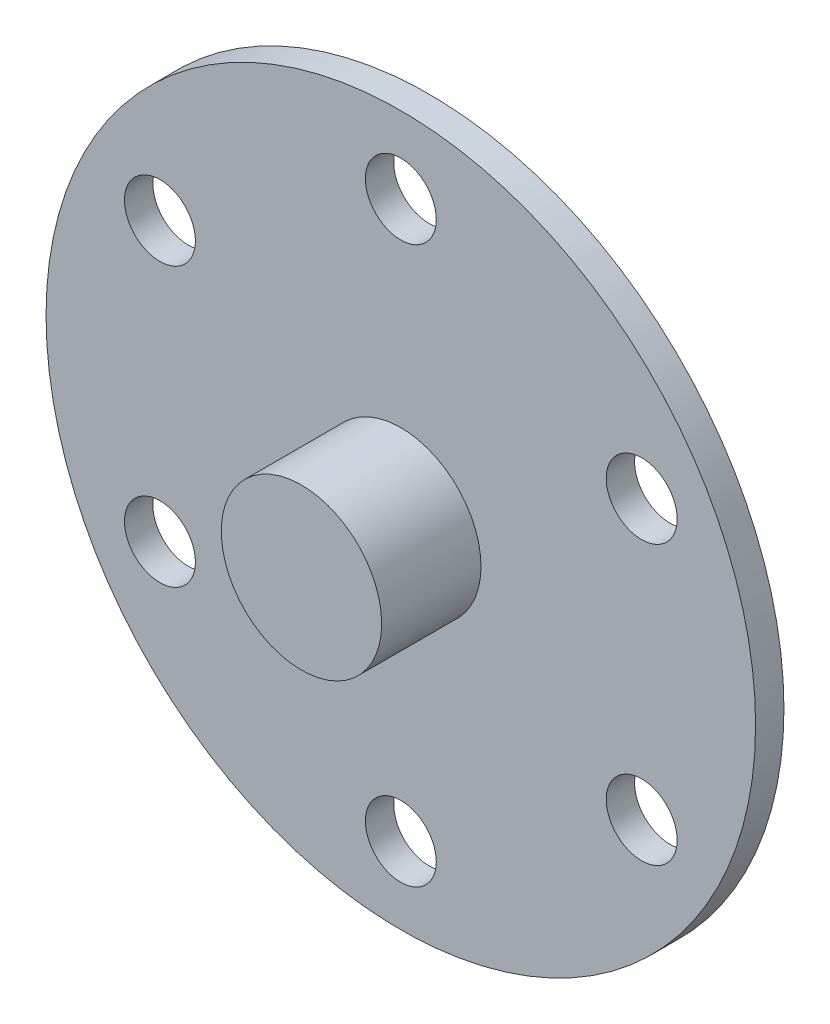
ISO-10303-21;
HEADER;
FILE_DESCRIPTION(('STEP AP214'),'2;1');
FILE_NAME('part.step','',(''),(''),'','','');
FILE_SCHEMA(('AUTOMOTIVE_DESIGN { 1 0 10303 214 1 1 1 1 }'));
ENDSEC;
DATA;
#1=APPLICATION_CONTEXT('core data for automotive mechanical design processes');
#2=APPLICATION_PROTOCOL_DEFINITION('international standard','automotive_design',2000,#1);
#3=PRODUCT_CONTEXT('',#1,'mechanical');
#4=PRODUCT('Part','Part','',(#3));
#5=PRODUCT_RELATED_PRODUCT_CATEGORY('part','',(#4));
#6=PRODUCT_DEFINITION_FORMATION('','',#4);
#7=PRODUCT_DEFINITION_CONTEXT('part definition',#1,'design');
#8=PRODUCT_DEFINITION('design','',#6,#7);
#9=PRODUCT_DEFINITION_SHAPE('','',#8);
#10=(LENGTH_UNIT() NAMED_UNIT(*) SI_UNIT(.MILLI.,.METRE.));
#11=(NAMED_UNIT(*) PLANE_ANGLE_UNIT() SI_UNIT($,.RADIAN.));
#12=(NAMED_UNIT(*) SI_UNIT($,.STERADIAN.) SOLID_ANGLE_UNIT());
#13=UNCERTAINTY_MEASURE_WITH_UNIT(LENGTH_MEASURE(1.E-05),#10,'distance_accuracy_value','');
#14=(GEOMETRIC_REPRESENTATION_CONTEXT(3) GLOBAL_UNCERTAINTY_ASSIGNED_CONTEXT((#13)) GLOBAL_UNIT_ASSIGNED_CONTEXT((#10,
#11,#12)) REPRESENTATION_CONTEXT('',''));
#15=CARTESIAN_POINT('',(0.,0.,0.));
#16=DIRECTION('',(0.,0.,1.));
#17=DIRECTION('',(1.,0.,0.));
#18=AXIS2_PLACEMENT_3D('',#15,#16,#17);
#19=CARTESIAN_POINT('',(0.,0.,-5.08));
#20=DIRECTION('',(0.,0.,1.));
#21=DIRECTION('',(1.,0.,0.));
#22=AXIS2_PLACEMENT_3D('',#19,#20,#21);
#23=CYLINDRICAL_SURFACE('',#22,63.5);
#24=CARTESIAN_POINT('',(0.,0.,-5.08));
#25=DIRECTION('',(0.,0.,1.));
#26=DIRECTION('',(1.,0.,0.));
#27=AXIS2_PLACEMENT_3D('',#24,#25,#26);
#28=CIRCLE('',#27,63.5);
#29=CARTESIAN_POINT('',(63.5,0.,-5.08));
#30=VERTEX_POINT('',#29);
#31=EDGE_CURVE('E41',#30,#30,#28,.T.);
#32=ORIENTED_EDGE('',*,*,#31,.T.);
#33=EDGE_LOOP('',(#32));
#34=FACE_BOUND('',#33,.T.);
#35=CARTESIAN_POINT('',(0.,0.,0.));
#36=DIRECTION('',(0.,0.,1.));
#37=DIRECTION('',(1.,0.,0.));
#38=AXIS2_PLACEMENT_3D('',#35,#36,#37);
#39=CIRCLE('',#38,63.5);
#40=CARTESIAN_POINT('',(63.5,0.,0.));
#41=VERTEX_POINT('',#40);
#42=EDGE_CURVE('E37',#41,#41,#39,.T.);
#43=ORIENTED_EDGE('',*,*,#42,.F.);
#44=EDGE_LOOP('',(#43));
#45=FACE_BOUND('',#44,.T.);
#46=ADVANCED_FACE('F34',(#34,#45),#23,.T.);
#47=CARTESIAN_POINT('',(0.,0.,-5.08));
#48=DIRECTION('',(0.,0.,1.));
#49=DIRECTION('',(1.,0.,0.));
#50=AXIS2_PLACEMENT_3D('',#47,#48,#49);
#51=PLANE('',#50);
#52=CARTESIAN_POINT('',(0.,49.784,-5.08));
#53=DIRECTION('',(0.,0.,1.));
#54=DIRECTION('',(1.,0.,0.));
#55=AXIS2_PLACEMENT_3D('',#52,#53,#54);
#56=CIRCLE('',#55,6.35);
#57=CARTESIAN_POINT('',(6.35,49.784,-5.08));
#58=VERTEX_POINT('',#57);
#59=EDGE_CURVE('E50',#58,#58,#56,.T.);
#60=ORIENTED_EDGE('',*,*,#59,.T.);
#61=EDGE_LOOP('',(#60));
#62=FACE_BOUND('',#61,.T.);
#63=CARTESIAN_POINT('',(-43.1142087020038,24.8919999999987,-5.08));
#64=DIRECTION('',(0.,0.,1.));
#65=DIRECTION('',(1.,0.,0.));
#66=AXIS2_PLACEMENT_3D('',#63,#64,#65);
#67=CIRCLE('',#66,6.35000000000162);
#68=CARTESIAN_POINT('',(-36.7642087020022,24.8919999999987,-5.08));
#69=VERTEX_POINT('',#68);
#70=EDGE_CURVE('E53',#69,#69,#67,.T.);
#71=ORIENTED_EDGE('',*,*,#70,.T.);
#72=EDGE_LOOP('',(#71));
#73=FACE_BOUND('',#72,.T.);
#74=CARTESIAN_POINT('',(-43.1142087020024,-24.8920000000012,-5.08));
#75=DIRECTION('',(0.,0.,1.));
#76=DIRECTION('',(1.,0.,0.));
#77=AXIS2_PLACEMENT_3D('',#74,#75,#76);
#78=CIRCLE('',#77,6.35000000000283);
#79=CARTESIAN_POINT('',(-36.7642087019996,-24.8920000000012,-5.08));
#80=VERTEX_POINT('',#79);
#81=EDGE_CURVE('E56',#80,#80,#78,.T.);
#82=ORIENTED_EDGE('',*,*,#81,.T.);
#83=EDGE_LOOP('',(#82));
#84=FACE_BOUND('',#83,.T.);
#85=CARTESIAN_POINT('',(2.81328214524155E-12,-49.784,-5.08));
#86=DIRECTION('',(0.,0.,1.));
#87=DIRECTION('',(1.,0.,0.));
#88=AXIS2_PLACEMENT_3D('',#85,#86,#87);
#89=CIRCLE('',#88,6.35000000000302);
#90=CARTESIAN_POINT('',(6.35000000000584,-49.784,-5.08));
#91=VERTEX_POINT('',#90);
#92=EDGE_CURVE('E59',#91,#91,#89,.T.);
#93=ORIENTED_EDGE('',*,*,#92,.T.);
#94=EDGE_LOOP('',(#93));
#95=FACE_BOUND('',#94,.T.);
#96=CARTESIAN_POINT('',(43.1142087020066,-24.8919999999988,-5.08));
#97=DIRECTION('',(0.,0.,1.));
#98=DIRECTION('',(1.,0.,0.));
#99=AXIS2_PLACEMENT_3D('',#96,#97,#98);
#100=CIRCLE('',#99,6.3500000000019);
#101=CARTESIAN_POINT('',(49.4642087020085,-24.8919999999988,-5.08));
#102=VERTEX_POINT('',#101);
#103=EDGE_CURVE('E62',#102,#102,#100,.T.);
#104=ORIENTED_EDGE('',*,*,#103,.T.);
#105=EDGE_LOOP('',(#104));
#106=FACE_BOUND('',#105,.T.);
#107=CARTESIAN_POINT('',(43.1142087020052,24.8920000000012,-5.08));
#108=DIRECTION('',(0.,0.,1.));
#109=DIRECTION('',(1.,0.,0.));
#110=AXIS2_PLACEMENT_3D('',#107,#108,#109);
#111=CIRCLE('',#110,6.35000000000045);
#112=CARTESIAN_POINT('',(49.4642087020056,24.8920000000012,-5.08));
#113=VERTEX_POINT('',#112);
#114=EDGE_CURVE('E65',#113,#113,#111,.T.);
#115=ORIENTED_EDGE('',*,*,#114,.T.);
#116=EDGE_LOOP('',(#115));
#117=FACE_BOUND('',#116,.T.);
#118=ORIENTED_EDGE('',*,*,#31,.F.);
#119=EDGE_LOOP('',(#118));
#120=FACE_BOUND('',#119,.T.);
#121=ADVANCED_FACE('F94',(#62,#73,#84,#95,#106,#117,#120),#51,.F.);
#122=CARTESIAN_POINT('',(0.,0.,0.));
#123=DIRECTION('',(0.,0.,1.));
#124=DIRECTION('',(1.,0.,0.));
#125=AXIS2_PLACEMENT_3D('',#122,#123,#124);
#126=PLANE('',#125);
#127=CARTESIAN_POINT('',(0.,49.784,0.));
#128=DIRECTION('',(0.,0.,1.));
#129=DIRECTION('',(1.,0.,0.));
#130=AXIS2_PLACEMENT_3D('',#127,#128,#129);
#131=CIRCLE('',#130,6.35);
#132=CARTESIAN_POINT('',(6.35,49.784,0.));
#133=VERTEX_POINT('',#132);
#134=EDGE_CURVE('E68',#133,#133,#131,.T.);
#135=ORIENTED_EDGE('',*,*,#134,.F.);
#136=EDGE_LOOP('',(#135));
#137=FACE_BOUND('',#136,.T.);
#138=CARTESIAN_POINT('',(-43.1142087020038,24.8919999999987,0.));
#139=DIRECTION('',(0.,0.,1.));
#140=DIRECTION('',(1.,0.,0.));
#141=AXIS2_PLACEMENT_3D('',#138,#139,#140);
#142=CIRCLE('',#141,6.35000000000162);
#143=CARTESIAN_POINT('',(-36.7642087020022,24.8919999999987,0.));
#144=VERTEX_POINT('',#143);
#145=EDGE_CURVE('E73',#144,#144,#142,.T.);
#146=ORIENTED_EDGE('',*,*,#145,.F.);
#147=EDGE_LOOP('',(#146));
#148=FACE_BOUND('',#147,.T.);
#149=CARTESIAN_POINT('',(-43.1142087020024,-24.8920000000012,0.));
#150=DIRECTION('',(0.,0.,1.));
#151=DIRECTION('',(1.,0.,0.));
#152=AXIS2_PLACEMENT_3D('',#149,#150,#151);
#153=CIRCLE('',#152,6.35000000000283);
#154=CARTESIAN_POINT('',(-36.7642087019996,-24.8920000000012,0.));
#155=VERTEX_POINT('',#154);
#156=EDGE_CURVE('E69',#155,#155,#153,.T.);
#157=ORIENTED_EDGE('',*,*,#156,.F.);
#158=EDGE_LOOP('',(#157));
#159=FACE_BOUND('',#158,.T.);
#160=CARTESIAN_POINT('',(2.81328214524155E-12,-49.784,0.));
#161=DIRECTION('',(0.,0.,1.));
#162=DIRECTION('',(1.,0.,0.));
#163=AXIS2_PLACEMENT_3D('',#160,#161,#162);
#164=CIRCLE('',#163,6.35000000000302);
#165=CARTESIAN_POINT('',(6.35000000000584,-49.784,0.));
#166=VERTEX_POINT('',#165);
#167=EDGE_CURVE('E72',#166,#166,#164,.T.);
#168=ORIENTED_EDGE('',*,*,#167,.F.);
#169=EDGE_LOOP('',(#168));
#170=FACE_BOUND('',#169,.T.);
#171=CARTESIAN_POINT('',(43.1142087020066,-24.8919999999988,0.));
#172=DIRECTION('',(0.,0.,1.));
#173=DIRECTION('',(1.,0.,0.));
#174=AXIS2_PLACEMENT_3D('',#171,#172,#173);
#175=CIRCLE('',#174,6.3500000000019);
#176=CARTESIAN_POINT('',(49.4642087020085,-24.8919999999988,0.));
#177=VERTEX_POINT('',#176);
#178=EDGE_CURVE('E76',#177,#177,#175,.T.);
#179=ORIENTED_EDGE('',*,*,#178,.F.);
#180=EDGE_LOOP('',(#179));
#181=FACE_BOUND('',#180,.T.);
#182=CARTESIAN_POINT('',(43.1142087020052,24.8920000000012,0.));
#183=DIRECTION('',(0.,0.,1.));
#184=DIRECTION('',(1.,0.,0.));
#185=AXIS2_PLACEMENT_3D('',#182,#183,#184);
#186=CIRCLE('',#185,6.35000000000045);
#187=CARTESIAN_POINT('',(49.4642087020056,24.8920000000012,0.));
#188=VERTEX_POINT('',#187);
#189=EDGE_CURVE('E79',#188,#188,#186,.T.);
#190=ORIENTED_EDGE('',*,*,#189,.F.);
#191=EDGE_LOOP('',(#190));
#192=FACE_BOUND('',#191,.T.);
#193=CARTESIAN_POINT('',(0.,0.,0.));
#194=DIRECTION('',(0.,0.,1.));
#195=DIRECTION('',(1.,0.,0.));
#196=AXIS2_PLACEMENT_3D('',#193,#194,#195);
#197=CIRCLE('',#196,14.351);
#198=CARTESIAN_POINT('',(14.351,0.,0.));
#199=VERTEX_POINT('',#198);
#200=EDGE_CURVE('E10',#199,#199,#197,.T.);
#201=ORIENTED_EDGE('',*,*,#200,.F.);
#202=EDGE_LOOP('',(#201));
#203=FACE_BOUND('',#202,.T.);
#204=ORIENTED_EDGE('',*,*,#42,.T.);
#205=EDGE_LOOP('',(#204));
#206=FACE_BOUND('',#205,.T.);
#207=ADVANCED_FACE('F90',(#137,#148,#159,#170,#181,#192,#203,#206),#126,.T.);
#208=CARTESIAN_POINT('',(0.,0.,17.78));
#209=DIRECTION('',(0.,0.,-1.));
#210=DIRECTION('',(-1.,0.,0.));
#211=AXIS2_PLACEMENT_3D('',#208,#209,#210);
#212=CYLINDRICAL_SURFACE('',#211,14.351);
#213=CARTESIAN_POINT('',(0.,0.,17.78));
#214=DIRECTION('',(0.,0.,1.));
#215=DIRECTION('',(1.,0.,0.));
#216=AXIS2_PLACEMENT_3D('',#213,#214,#215);
#217=CIRCLE('',#216,14.351);
#218=CARTESIAN_POINT('',(14.351,0.,17.78));
#219=VERTEX_POINT('',#218);
#220=EDGE_CURVE('E47',#219,#219,#217,.T.);
#221=ORIENTED_EDGE('',*,*,#220,.F.);
#222=EDGE_LOOP('',(#221));
#223=FACE_BOUND('',#222,.T.);
#224=ORIENTED_EDGE('',*,*,#200,.T.);
#225=EDGE_LOOP('',(#224));
#226=FACE_BOUND('',#225,.T.);
#227=ADVANCED_FACE('F93',(#223,#226),#212,.T.);
#228=CARTESIAN_POINT('',(0.,0.,17.78));
#229=DIRECTION('',(0.,0.,1.));
#230=DIRECTION('',(1.,0.,0.));
#231=AXIS2_PLACEMENT_3D('',#228,#229,#230);
#232=PLANE('',#231);
#233=ORIENTED_EDGE('',*,*,#220,.T.);
#234=EDGE_LOOP('',(#233));
#235=FACE_BOUND('',#234,.T.);
#236=ADVANCED_FACE('F124',(#235),#232,.T.);
#237=CARTESIAN_POINT('',(43.1142087020052,24.8920000000012,-17.78));
#238=DIRECTION('',(0.,0.,1.));
#239=DIRECTION('',(1.,0.,0.));
#240=AXIS2_PLACEMENT_3D('',#237,#238,#239);
#241=CYLINDRICAL_SURFACE('',#240,6.35000000000045);
#242=ORIENTED_EDGE('',*,*,#189,.T.);
#243=EDGE_LOOP('',(#242));
#244=FACE_BOUND('',#243,.T.);
#245=ORIENTED_EDGE('',*,*,#114,.F.);
#246=EDGE_LOOP('',(#245));
#247=FACE_BOUND('',#246,.T.);
#248=ADVANCED_FACE('F128',(#244,#247),#241,.F.);
#249=CARTESIAN_POINT('',(43.1142087020066,-24.8919999999988,-17.78));
#250=DIRECTION('',(0.,0.,1.));
#251=DIRECTION('',(1.,0.,0.));
#252=AXIS2_PLACEMENT_3D('',#249,#250,#251);
#253=CYLINDRICAL_SURFACE('',#252,6.3500000000019);
#254=ORIENTED_EDGE('',*,*,#178,.T.);
#255=EDGE_LOOP('',(#254));
#256=FACE_BOUND('',#255,.T.);
#257=ORIENTED_EDGE('',*,*,#103,.F.);
#258=EDGE_LOOP('',(#257));
#259=FACE_BOUND('',#258,.T.);
#260=ADVANCED_FACE('F138',(#256,#259),#253,.F.);
#261=CARTESIAN_POINT('',(2.81328214524155E-12,-49.784,-17.78));
#262=DIRECTION('',(0.,0.,1.));
#263=DIRECTION('',(1.,0.,0.));
#264=AXIS2_PLACEMENT_3D('',#261,#262,#263);
#265=CYLINDRICAL_SURFACE('',#264,6.35000000000302);
#266=ORIENTED_EDGE('',*,*,#167,.T.);
#267=EDGE_LOOP('',(#266));
#268=FACE_BOUND('',#267,.T.);
#269=ORIENTED_EDGE('',*,*,#92,.F.);
#270=EDGE_LOOP('',(#269));
#271=FACE_BOUND('',#270,.T.);
#272=ADVANCED_FACE('F134',(#268,#271),#265,.F.);
#273=CARTESIAN_POINT('',(-43.1142087020024,-24.8920000000012,-17.78));
#274=DIRECTION('',(0.,0.,1.));
#275=DIRECTION('',(1.,0.,0.));
#276=AXIS2_PLACEMENT_3D('',#273,#274,#275);
#277=CYLINDRICAL_SURFACE('',#276,6.35000000000283);
#278=ORIENTED_EDGE('',*,*,#156,.T.);
#279=EDGE_LOOP('',(#278));
#280=FACE_BOUND('',#279,.T.);
#281=ORIENTED_EDGE('',*,*,#81,.F.);
#282=EDGE_LOOP('',(#281));
#283=FACE_BOUND('',#282,.T.);
#284=ADVANCED_FACE('F130',(#280,#283),#277,.F.);
#285=CARTESIAN_POINT('',(-43.1142087020038,24.8919999999987,-17.78));
#286=DIRECTION('',(0.,0.,1.));
#287=DIRECTION('',(1.,0.,0.));
#288=AXIS2_PLACEMENT_3D('',#285,#286,#287);
#289=CYLINDRICAL_SURFACE('',#288,6.35000000000162);
#290=ORIENTED_EDGE('',*,*,#145,.T.);
#291=EDGE_LOOP('',(#290));
#292=FACE_BOUND('',#291,.T.);
#293=ORIENTED_EDGE('',*,*,#70,.F.);
#294=EDGE_LOOP('',(#293));
#295=FACE_BOUND('',#294,.T.);
#296=ADVANCED_FACE('F133',(#292,#295),#289,.F.);
#297=CARTESIAN_POINT('',(0.,49.784,-17.78));
#298=DIRECTION('',(0.,0.,1.));
#299=DIRECTION('',(1.,0.,0.));
#300=AXIS2_PLACEMENT_3D('',#297,#298,#299);
#301=CYLINDRICAL_SURFACE('',#300,6.35);
#302=ORIENTED_EDGE('',*,*,#134,.T.);
#303=EDGE_LOOP('',(#302));
#304=FACE_BOUND('',#303,.T.);
#305=ORIENTED_EDGE('',*,*,#59,.F.);
#306=EDGE_LOOP('',(#305));
#307=FACE_BOUND('',#306,.T.);
#308=ADVANCED_FACE('F87',(#304,#307),#301,.F.);
#309=CLOSED_SHELL('',(#46,#121,#207,#227,#236,#248,#260,#272,#284,#296,#308));
#310=MANIFOLD_SOLID_BREP('B2',#309);
#311=ADVANCED_BREP_SHAPE_REPRESENTATION('',(#18,#310),#14);
#312=SHAPE_DEFINITION_REPRESENTATION(#9,#311);
ENDSEC;
END-ISO-10303-21;
